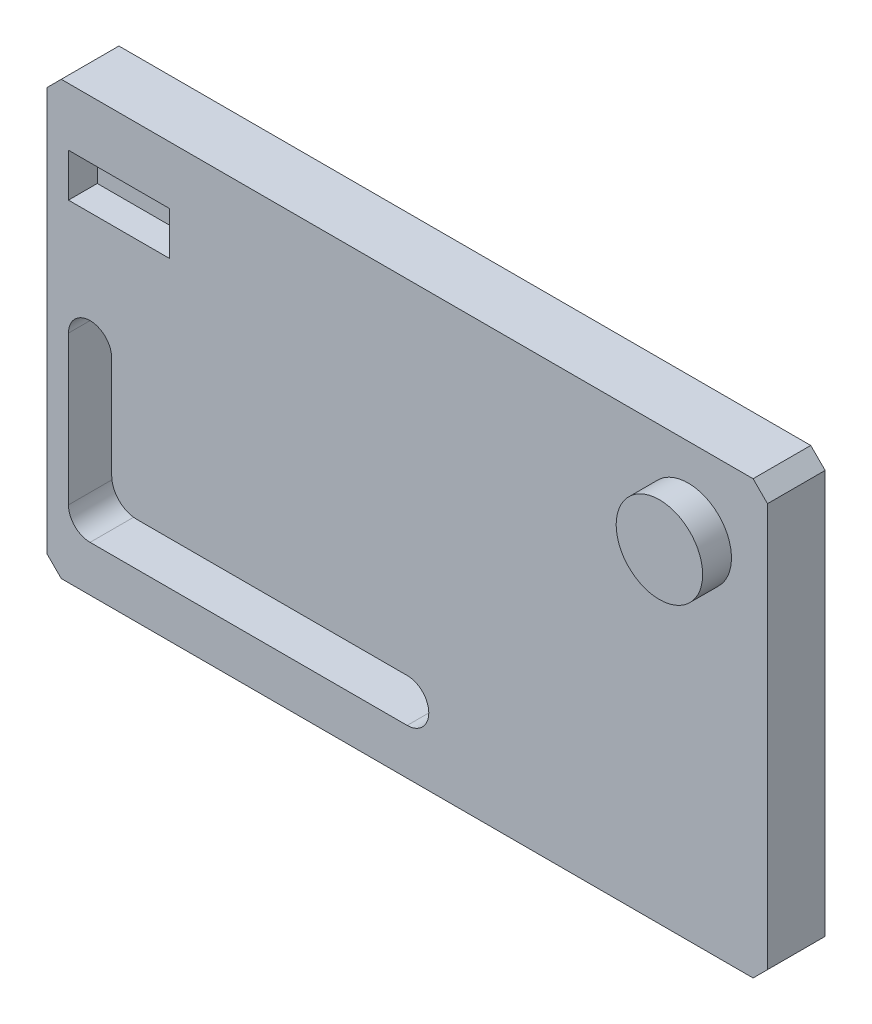
ISO-10303-21;
HEADER;
FILE_DESCRIPTION(('STEP AP214'),'2;1');
FILE_NAME('part.step','',(''),(''),'','','');
FILE_SCHEMA(('AUTOMOTIVE_DESIGN { 1 0 10303 214 1 1 1 1 }'));
ENDSEC;
DATA;
#1=APPLICATION_CONTEXT('core data for automotive mechanical design processes');
#2=APPLICATION_PROTOCOL_DEFINITION('international standard','automotive_design',2000,#1);
#3=PRODUCT_CONTEXT('',#1,'mechanical');
#4=PRODUCT('Part','Part','',(#3));
#5=PRODUCT_RELATED_PRODUCT_CATEGORY('part','',(#4));
#6=PRODUCT_DEFINITION_FORMATION('','',#4);
#7=PRODUCT_DEFINITION_CONTEXT('part definition',#1,'design');
#8=PRODUCT_DEFINITION('design','',#6,#7);
#9=PRODUCT_DEFINITION_SHAPE('','',#8);
#10=(LENGTH_UNIT() NAMED_UNIT(*) SI_UNIT(.MILLI.,.METRE.));
#11=(NAMED_UNIT(*) PLANE_ANGLE_UNIT() SI_UNIT($,.RADIAN.));
#12=(NAMED_UNIT(*) SI_UNIT($,.STERADIAN.) SOLID_ANGLE_UNIT());
#13=UNCERTAINTY_MEASURE_WITH_UNIT(LENGTH_MEASURE(1.E-05),#10,'distance_accuracy_value','');
#14=(GEOMETRIC_REPRESENTATION_CONTEXT(3) GLOBAL_UNCERTAINTY_ASSIGNED_CONTEXT((#13)) GLOBAL_UNIT_ASSIGNED_CONTEXT((#10,
#11,#12)) REPRESENTATION_CONTEXT('',''));
#15=CARTESIAN_POINT('',(0.,0.,0.));
#16=DIRECTION('',(0.,0.,1.));
#17=DIRECTION('',(1.,0.,0.));
#18=AXIS2_PLACEMENT_3D('',#15,#16,#17);
#19=CARTESIAN_POINT('',(0.,0.,2.));
#20=DIRECTION('',(0.,0.,-1.));
#21=DIRECTION('',(-1.,0.,0.));
#22=AXIS2_PLACEMENT_3D('',#19,#20,#21);
#23=PLANE('',#22);
#24=DIRECTION('',(0.,1.,0.));
#25=VECTOR('',#24,1.);
#26=CARTESIAN_POINT('',(-12.5,-7.5,2.));
#27=LINE('',#26,#25);
#28=CARTESIAN_POINT('',(-12.5,-7.,2.));
#29=VERTEX_POINT('',#28);
#30=CARTESIAN_POINT('',(-12.5,7.,2.));
#31=VERTEX_POINT('',#30);
#32=EDGE_CURVE('E291',#29,#31,#27,.T.);
#33=ORIENTED_EDGE('',*,*,#32,.F.);
#34=DIRECTION('',(0.707106781186548,-0.707106781186548,0.));
#35=VECTOR('',#34,1.);
#36=CARTESIAN_POINT('',(-12.,-7.5,2.));
#37=LINE('',#36,#35);
#38=CARTESIAN_POINT('',(-12.,-7.5,2.));
#39=VERTEX_POINT('',#38);
#40=EDGE_CURVE('E357',#29,#39,#37,.T.);
#41=ORIENTED_EDGE('',*,*,#40,.T.);
#42=DIRECTION('',(1.,0.,0.));
#43=VECTOR('',#42,1.);
#44=CARTESIAN_POINT('',(-12.5,-7.5,2.));
#45=LINE('',#44,#43);
#46=CARTESIAN_POINT('',(12.,-7.5,2.));
#47=VERTEX_POINT('',#46);
#48=EDGE_CURVE('E304',#39,#47,#45,.T.);
#49=ORIENTED_EDGE('',*,*,#48,.T.);
#50=DIRECTION('',(-0.70710678118655,-0.707106781186545,0.));
#51=VECTOR('',#50,1.);
#52=CARTESIAN_POINT('',(12.5,-7.,2.));
#53=LINE('',#52,#51);
#54=CARTESIAN_POINT('',(12.5,-7.,2.));
#55=VERTEX_POINT('',#54);
#56=EDGE_CURVE('E354',#47,#55,#53,.F.);
#57=ORIENTED_EDGE('',*,*,#56,.T.);
#58=DIRECTION('',(0.,1.,0.));
#59=VECTOR('',#58,1.);
#60=CARTESIAN_POINT('',(12.5,-7.5,2.));
#61=LINE('',#60,#59);
#62=CARTESIAN_POINT('',(12.5,7.,2.));
#63=VERTEX_POINT('',#62);
#64=EDGE_CURVE('E300',#55,#63,#61,.T.);
#65=ORIENTED_EDGE('',*,*,#64,.T.);
#66=DIRECTION('',(-0.707106781186548,0.707106781186548,0.));
#67=VECTOR('',#66,1.);
#68=CARTESIAN_POINT('',(12.,7.5,2.));
#69=LINE('',#68,#67);
#70=CARTESIAN_POINT('',(12.,7.5,2.));
#71=VERTEX_POINT('',#70);
#72=EDGE_CURVE('E348',#63,#71,#69,.T.);
#73=ORIENTED_EDGE('',*,*,#72,.T.);
#74=DIRECTION('',(1.,0.,0.));
#75=VECTOR('',#74,1.);
#76=CARTESIAN_POINT('',(-12.5,7.5,2.));
#77=LINE('',#76,#75);
#78=CARTESIAN_POINT('',(-12.,7.5,2.));
#79=VERTEX_POINT('',#78);
#80=EDGE_CURVE('E295',#79,#71,#77,.T.);
#81=ORIENTED_EDGE('',*,*,#80,.F.);
#82=DIRECTION('',(0.70710678118655,0.707106781186545,0.));
#83=VECTOR('',#82,1.);
#84=CARTESIAN_POINT('',(-12.5,7.,2.));
#85=LINE('',#84,#83);
#86=EDGE_CURVE('E351',#79,#31,#85,.F.);
#87=ORIENTED_EDGE('',*,*,#86,.T.);
#88=EDGE_LOOP('',(#33,#41,#49,#57,#65,#73,#81,#87));
#89=FACE_BOUND('',#88,.T.);
#90=CARTESIAN_POINT('',(9.75,4.7447,2.));
#91=DIRECTION('',(0.,0.,-1.));
#92=DIRECTION('',(-1.,0.,0.));
#93=AXIS2_PLACEMENT_3D('',#90,#91,#92);
#94=CIRCLE('',#93,1.5);
#95=CARTESIAN_POINT('',(8.25,4.7447,2.));
#96=VERTEX_POINT('',#95);
#97=EDGE_CURVE('E374',#96,#96,#94,.F.);
#98=ORIENTED_EDGE('',*,*,#97,.F.);
#99=EDGE_LOOP('',(#98));
#100=FACE_BOUND('',#99,.T.);
#101=DIRECTION('',(0.,-1.,0.));
#102=VECTOR('',#101,1.);
#103=CARTESIAN_POINT('',(-8.25,5.4947,2.));
#104=LINE('',#103,#102);
#105=CARTESIAN_POINT('',(-8.25,5.4947,2.));
#106=VERTEX_POINT('',#105);
#107=CARTESIAN_POINT('',(-8.25,3.9947,2.));
#108=VERTEX_POINT('',#107);
#109=EDGE_CURVE('E250',#106,#108,#104,.T.);
#110=ORIENTED_EDGE('',*,*,#109,.T.);
#111=DIRECTION('',(1.,0.,0.));
#112=VECTOR('',#111,1.);
#113=CARTESIAN_POINT('',(-11.75,3.9947,2.));
#114=LINE('',#113,#112);
#115=CARTESIAN_POINT('',(-11.75,3.9947,2.));
#116=VERTEX_POINT('',#115);
#117=EDGE_CURVE('E255',#116,#108,#114,.T.);
#118=ORIENTED_EDGE('',*,*,#117,.F.);
#119=DIRECTION('',(0.,-1.,0.));
#120=VECTOR('',#119,1.);
#121=CARTESIAN_POINT('',(-11.75,5.4947,2.));
#122=LINE('',#121,#120);
#123=CARTESIAN_POINT('',(-11.75,5.4947,2.));
#124=VERTEX_POINT('',#123);
#125=EDGE_CURVE('E260',#124,#116,#122,.T.);
#126=ORIENTED_EDGE('',*,*,#125,.F.);
#127=DIRECTION('',(1.,0.,0.));
#128=VECTOR('',#127,1.);
#129=CARTESIAN_POINT('',(-11.75,5.4947,2.));
#130=LINE('',#129,#128);
#131=EDGE_CURVE('E244',#124,#106,#130,.T.);
#132=ORIENTED_EDGE('',*,*,#131,.T.);
#133=EDGE_LOOP('',(#110,#118,#126,#132));
#134=FACE_BOUND('',#133,.T.);
#135=DIRECTION('',(0.,1.,0.));
#136=VECTOR('',#135,1.);
#137=CARTESIAN_POINT('',(-10.25,-5.16161867259879,2.));
#138=LINE('',#137,#136);
#139=CARTESIAN_POINT('',(-10.25,-3.53661867259879,2.));
#140=VERTEX_POINT('',#139);
#141=CARTESIAN_POINT('',(-10.25,0.,2.));
#142=VERTEX_POINT('',#141);
#143=EDGE_CURVE('E409',#140,#142,#138,.T.);
#144=ORIENTED_EDGE('',*,*,#143,.F.);
#145=CARTESIAN_POINT('',(-9.375,-3.53661867259879,2.));
#146=DIRECTION('',(0.,0.,-1.));
#147=DIRECTION('',(-1.,0.,0.));
#148=AXIS2_PLACEMENT_3D('',#145,#146,#147);
#149=CIRCLE('',#148,0.875);
#150=CARTESIAN_POINT('',(-9.375,-4.41161867259879,2.));
#151=VERTEX_POINT('',#150);
#152=EDGE_CURVE('E12',#140,#151,#149,.F.);
#153=ORIENTED_EDGE('',*,*,#152,.T.);
#154=DIRECTION('',(1.,0.,0.));
#155=VECTOR('',#154,1.);
#156=CARTESIAN_POINT('',(-11.,-4.41161867259879,2.));
#157=LINE('',#156,#155);
#158=CARTESIAN_POINT('',(0.,-4.41161867259879,2.));
#159=VERTEX_POINT('',#158);
#160=EDGE_CURVE('E226',#151,#159,#157,.T.);
#161=ORIENTED_EDGE('',*,*,#160,.T.);
#162=CARTESIAN_POINT('',(0.,-5.16161867259879,2.));
#163=DIRECTION('',(0.,0.,1.));
#164=DIRECTION('',(1.,0.,0.));
#165=AXIS2_PLACEMENT_3D('',#162,#163,#164);
#166=CIRCLE('',#165,0.75);
#167=CARTESIAN_POINT('',(0.,-5.91161867259879,2.));
#168=VERTEX_POINT('',#167);
#169=EDGE_CURVE('E217',#168,#159,#166,.T.);
#170=ORIENTED_EDGE('',*,*,#169,.F.);
#171=DIRECTION('',(1.,0.,0.));
#172=VECTOR('',#171,1.);
#173=CARTESIAN_POINT('',(-11.,-5.91161867259879,2.));
#174=LINE('',#173,#172);
#175=CARTESIAN_POINT('',(-11.,-5.91161867259879,2.));
#176=VERTEX_POINT('',#175);
#177=EDGE_CURVE('E212',#176,#168,#174,.T.);
#178=ORIENTED_EDGE('',*,*,#177,.F.);
#179=CARTESIAN_POINT('',(-11.,-5.16161867259879,2.));
#180=DIRECTION('',(0.,0.,1.));
#181=DIRECTION('',(1.,0.,0.));
#182=AXIS2_PLACEMENT_3D('',#179,#180,#181);
#183=CIRCLE('',#182,0.75);
#184=CARTESIAN_POINT('',(-11.75,-5.16161867259879,2.));
#185=VERTEX_POINT('',#184);
#186=EDGE_CURVE('E203',#185,#176,#183,.T.);
#187=ORIENTED_EDGE('',*,*,#186,.F.);
#188=DIRECTION('',(0.,1.,0.));
#189=VECTOR('',#188,1.);
#190=CARTESIAN_POINT('',(-11.75,-5.16161867259879,2.));
#191=LINE('',#190,#189);
#192=CARTESIAN_POINT('',(-11.75,0.,2.));
#193=VERTEX_POINT('',#192);
#194=EDGE_CURVE('E184',#185,#193,#191,.T.);
#195=ORIENTED_EDGE('',*,*,#194,.T.);
#196=CARTESIAN_POINT('',(-11.,0.,2.));
#197=DIRECTION('',(0.,0.,1.));
#198=DIRECTION('',(1.,0.,0.));
#199=AXIS2_PLACEMENT_3D('',#196,#197,#198);
#200=CIRCLE('',#199,0.750000000000001);
#201=EDGE_CURVE('E197',#142,#193,#200,.T.);
#202=ORIENTED_EDGE('',*,*,#201,.F.);
#203=EDGE_LOOP('',(#144,#153,#161,#170,#178,#187,#195,#202));
#204=FACE_BOUND('',#203,.T.);
#205=ADVANCED_FACE('F49',(#89,#100,#134,#204),#23,.F.);
#206=CARTESIAN_POINT('',(0.,0.,0.));
#207=DIRECTION('',(0.,0.,-1.));
#208=DIRECTION('',(-1.,0.,0.));
#209=AXIS2_PLACEMENT_3D('',#206,#207,#208);
#210=PLANE('',#209);
#211=DIRECTION('',(1.,0.,0.));
#212=VECTOR('',#211,1.);
#213=CARTESIAN_POINT('',(-12.5,-7.5,0.));
#214=LINE('',#213,#212);
#215=CARTESIAN_POINT('',(-12.,-7.5,0.));
#216=VERTEX_POINT('',#215);
#217=CARTESIAN_POINT('',(12.,-7.5,0.));
#218=VERTEX_POINT('',#217);
#219=EDGE_CURVE('E296',#216,#218,#214,.T.);
#220=ORIENTED_EDGE('',*,*,#219,.F.);
#221=DIRECTION('',(-0.707106781186548,0.707106781186548,0.));
#222=VECTOR('',#221,1.);
#223=CARTESIAN_POINT('',(-9.75,-9.75,0.));
#224=LINE('',#223,#222);
#225=CARTESIAN_POINT('',(-12.5,-7.,0.));
#226=VERTEX_POINT('',#225);
#227=EDGE_CURVE('E338',#216,#226,#224,.T.);
#228=ORIENTED_EDGE('',*,*,#227,.T.);
#229=DIRECTION('',(0.,1.,0.));
#230=VECTOR('',#229,1.);
#231=CARTESIAN_POINT('',(-12.5,-7.5,0.));
#232=LINE('',#231,#230);
#233=CARTESIAN_POINT('',(-12.5,7.,0.));
#234=VERTEX_POINT('',#233);
#235=EDGE_CURVE('E290',#226,#234,#232,.T.);
#236=ORIENTED_EDGE('',*,*,#235,.T.);
#237=DIRECTION('',(-0.70710678118655,-0.707106781186545,0.));
#238=VECTOR('',#237,1.);
#239=CARTESIAN_POINT('',(-9.74999999999996,9.75000000000002,0.));
#240=LINE('',#239,#238);
#241=CARTESIAN_POINT('',(-12.,7.5,0.));
#242=VERTEX_POINT('',#241);
#243=EDGE_CURVE('E332',#234,#242,#240,.F.);
#244=ORIENTED_EDGE('',*,*,#243,.T.);
#245=DIRECTION('',(1.,0.,0.));
#246=VECTOR('',#245,1.);
#247=CARTESIAN_POINT('',(-12.5,7.5,0.));
#248=LINE('',#247,#246);
#249=CARTESIAN_POINT('',(12.,7.5,0.));
#250=VERTEX_POINT('',#249);
#251=EDGE_CURVE('E312',#242,#250,#248,.T.);
#252=ORIENTED_EDGE('',*,*,#251,.T.);
#253=DIRECTION('',(0.707106781186548,-0.707106781186548,0.));
#254=VECTOR('',#253,1.);
#255=CARTESIAN_POINT('',(9.75,9.75,0.));
#256=LINE('',#255,#254);
#257=CARTESIAN_POINT('',(12.5,7.,0.));
#258=VERTEX_POINT('',#257);
#259=EDGE_CURVE('E329',#250,#258,#256,.T.);
#260=ORIENTED_EDGE('',*,*,#259,.T.);
#261=DIRECTION('',(0.,1.,0.));
#262=VECTOR('',#261,1.);
#263=CARTESIAN_POINT('',(12.5,-7.5,0.));
#264=LINE('',#263,#262);
#265=CARTESIAN_POINT('',(12.5,-7.,0.));
#266=VERTEX_POINT('',#265);
#267=EDGE_CURVE('E316',#266,#258,#264,.T.);
#268=ORIENTED_EDGE('',*,*,#267,.F.);
#269=DIRECTION('',(0.70710678118655,0.707106781186545,0.));
#270=VECTOR('',#269,1.);
#271=CARTESIAN_POINT('',(9.74999999999996,-9.75000000000003,0.));
#272=LINE('',#271,#270);
#273=EDGE_CURVE('E335',#266,#218,#272,.F.);
#274=ORIENTED_EDGE('',*,*,#273,.T.);
#275=EDGE_LOOP('',(#220,#228,#236,#244,#252,#260,#268,#274));
#276=FACE_BOUND('',#275,.T.);
#277=DIRECTION('',(1.,0.,0.));
#278=VECTOR('',#277,1.);
#279=CARTESIAN_POINT('',(-11.,-4.41161867259879,0.));
#280=LINE('',#279,#278);
#281=CARTESIAN_POINT('',(-9.375,-4.41161867259879,0.));
#282=VERTEX_POINT('',#281);
#283=CARTESIAN_POINT('',(0.,-4.41161867259879,0.));
#284=VERTEX_POINT('',#283);
#285=EDGE_CURVE('E219',#282,#284,#280,.T.);
#286=ORIENTED_EDGE('',*,*,#285,.F.);
#287=CARTESIAN_POINT('',(-9.375,-3.53661867259879,0.));
#288=DIRECTION('',(0.,0.,-1.));
#289=DIRECTION('',(-1.,0.,0.));
#290=AXIS2_PLACEMENT_3D('',#287,#288,#289);
#291=CIRCLE('',#290,0.875);
#292=CARTESIAN_POINT('',(-10.25,-3.53661867259879,0.));
#293=VERTEX_POINT('',#292);
#294=EDGE_CURVE('E72',#282,#293,#291,.T.);
#295=ORIENTED_EDGE('',*,*,#294,.T.);
#296=DIRECTION('',(0.,1.,0.));
#297=VECTOR('',#296,1.);
#298=CARTESIAN_POINT('',(-10.25,-5.16161867259879,0.));
#299=LINE('',#298,#297);
#300=CARTESIAN_POINT('',(-10.25,0.,0.));
#301=VERTEX_POINT('',#300);
#302=EDGE_CURVE('E397',#293,#301,#299,.T.);
#303=ORIENTED_EDGE('',*,*,#302,.T.);
#304=CARTESIAN_POINT('',(-11.,0.,0.));
#305=DIRECTION('',(0.,0.,-1.));
#306=DIRECTION('',(-1.,0.,0.));
#307=AXIS2_PLACEMENT_3D('',#304,#305,#306);
#308=CIRCLE('',#307,0.750000000000001);
#309=CARTESIAN_POINT('',(-11.75,0.,0.));
#310=VERTEX_POINT('',#309);
#311=EDGE_CURVE('E207',#301,#310,#308,.F.);
#312=ORIENTED_EDGE('',*,*,#311,.T.);
#313=DIRECTION('',(0.,1.,0.));
#314=VECTOR('',#313,1.);
#315=CARTESIAN_POINT('',(-11.75,-5.16161867259879,0.));
#316=LINE('',#315,#314);
#317=CARTESIAN_POINT('',(-11.75,-5.16161867259879,0.));
#318=VERTEX_POINT('',#317);
#319=EDGE_CURVE('E412',#318,#310,#316,.T.);
#320=ORIENTED_EDGE('',*,*,#319,.F.);
#321=CARTESIAN_POINT('',(-11.,-5.16161867259879,0.));
#322=DIRECTION('',(0.,0.,-1.));
#323=DIRECTION('',(-1.,0.,0.));
#324=AXIS2_PLACEMENT_3D('',#321,#322,#323);
#325=CIRCLE('',#324,0.75);
#326=CARTESIAN_POINT('',(-11.,-5.91161867259879,0.));
#327=VERTEX_POINT('',#326);
#328=EDGE_CURVE('E205',#318,#327,#325,.F.);
#329=ORIENTED_EDGE('',*,*,#328,.T.);
#330=DIRECTION('',(1.,0.,0.));
#331=VECTOR('',#330,1.);
#332=CARTESIAN_POINT('',(-11.,-5.91161867259879,0.));
#333=LINE('',#332,#331);
#334=CARTESIAN_POINT('',(0.,-5.91161867259879,0.));
#335=VERTEX_POINT('',#334);
#336=EDGE_CURVE('E234',#327,#335,#333,.T.);
#337=ORIENTED_EDGE('',*,*,#336,.T.);
#338=CARTESIAN_POINT('',(0.,-5.16161867259879,0.));
#339=DIRECTION('',(0.,0.,-1.));
#340=DIRECTION('',(-1.,0.,0.));
#341=AXIS2_PLACEMENT_3D('',#338,#339,#340);
#342=CIRCLE('',#341,0.75);
#343=EDGE_CURVE('E394',#335,#284,#342,.F.);
#344=ORIENTED_EDGE('',*,*,#343,.T.);
#345=EDGE_LOOP('',(#286,#295,#303,#312,#320,#329,#337,#344));
#346=FACE_BOUND('',#345,.T.);
#347=ADVANCED_FACE('F392',(#276,#346),#210,.T.);
#348=CARTESIAN_POINT('',(-11.,-5.16161867259879,-0.00100000000000013));
#349=DIRECTION('',(0.,0.,1.));
#350=DIRECTION('',(1.,0.,0.));
#351=AXIS2_PLACEMENT_3D('',#348,#349,#350);
#352=CYLINDRICAL_SURFACE('',#351,0.75);
#353=DIRECTION('',(0.,0.,1.));
#354=VECTOR('',#353,1.);
#355=CARTESIAN_POINT('',(-11.75,-5.16161867259879,-0.00100000000000013));
#356=LINE('',#355,#354);
#357=EDGE_CURVE('E187',#318,#185,#356,.T.);
#358=ORIENTED_EDGE('',*,*,#357,.T.);
#359=ORIENTED_EDGE('',*,*,#186,.T.);
#360=DIRECTION('',(0.,0.,1.));
#361=VECTOR('',#360,1.);
#362=CARTESIAN_POINT('',(-11.,-5.91161867259879,-0.00100000000000013));
#363=LINE('',#362,#361);
#364=EDGE_CURVE('E229',#327,#176,#363,.T.);
#365=ORIENTED_EDGE('',*,*,#364,.F.);
#366=ORIENTED_EDGE('',*,*,#328,.F.);
#367=EDGE_LOOP('',(#358,#359,#365,#366));
#368=FACE_BOUND('',#367,.T.);
#369=ADVANCED_FACE('F201',(#368),#352,.F.);
#370=CARTESIAN_POINT('',(-12.5,-7.5,2.));
#371=DIRECTION('',(-1.,0.,0.));
#372=DIRECTION('',(0.,0.,1.));
#373=AXIS2_PLACEMENT_3D('',#370,#371,#372);
#374=PLANE('',#373);
#375=ORIENTED_EDGE('',*,*,#235,.F.);
#376=DIRECTION('',(0.,0.,1.));
#377=VECTOR('',#376,1.);
#378=CARTESIAN_POINT('',(-12.5,-7.,2.));
#379=LINE('',#378,#377);
#380=EDGE_CURVE('E345',#226,#29,#379,.T.);
#381=ORIENTED_EDGE('',*,*,#380,.T.);
#382=ORIENTED_EDGE('',*,*,#32,.T.);
#383=DIRECTION('',(0.,0.,-1.));
#384=VECTOR('',#383,1.);
#385=CARTESIAN_POINT('',(-12.5,7.,2.));
#386=LINE('',#385,#384);
#387=EDGE_CURVE('E341',#31,#234,#386,.T.);
#388=ORIENTED_EDGE('',*,*,#387,.T.);
#389=EDGE_LOOP('',(#375,#381,#382,#388));
#390=FACE_BOUND('',#389,.T.);
#391=ADVANCED_FACE('F446',(#390),#374,.T.);
#392=CARTESIAN_POINT('',(-12.5,-7.5,2.));
#393=DIRECTION('',(0.,1.,0.));
#394=DIRECTION('',(0.,0.,1.));
#395=AXIS2_PLACEMENT_3D('',#392,#393,#394);
#396=PLANE('',#395);
#397=ORIENTED_EDGE('',*,*,#48,.F.);
#398=DIRECTION('',(0.,0.,-1.));
#399=VECTOR('',#398,1.);
#400=CARTESIAN_POINT('',(-12.,-7.5,0.));
#401=LINE('',#400,#399);
#402=EDGE_CURVE('E325',#39,#216,#401,.T.);
#403=ORIENTED_EDGE('',*,*,#402,.T.);
#404=ORIENTED_EDGE('',*,*,#219,.T.);
#405=DIRECTION('',(0.,0.,1.));
#406=VECTOR('',#405,1.);
#407=CARTESIAN_POINT('',(12.,-7.5,2.));
#408=LINE('',#407,#406);
#409=EDGE_CURVE('E308',#218,#47,#408,.T.);
#410=ORIENTED_EDGE('',*,*,#409,.T.);
#411=EDGE_LOOP('',(#397,#403,#404,#410));
#412=FACE_BOUND('',#411,.T.);
#413=ADVANCED_FACE('F442',(#412),#396,.F.);
#414=CARTESIAN_POINT('',(12.5,-7.5,2.));
#415=DIRECTION('',(-1.,0.,0.));
#416=DIRECTION('',(0.,0.,1.));
#417=AXIS2_PLACEMENT_3D('',#414,#415,#416);
#418=PLANE('',#417);
#419=ORIENTED_EDGE('',*,*,#64,.F.);
#420=DIRECTION('',(0.,0.,-1.));
#421=VECTOR('',#420,1.);
#422=CARTESIAN_POINT('',(12.5,-7.,2.));
#423=LINE('',#422,#421);
#424=EDGE_CURVE('E363',#55,#266,#423,.T.);
#425=ORIENTED_EDGE('',*,*,#424,.T.);
#426=ORIENTED_EDGE('',*,*,#267,.T.);
#427=DIRECTION('',(0.,0.,1.));
#428=VECTOR('',#427,1.);
#429=CARTESIAN_POINT('',(12.5,7.,2.));
#430=LINE('',#429,#428);
#431=EDGE_CURVE('E360',#258,#63,#430,.T.);
#432=ORIENTED_EDGE('',*,*,#431,.T.);
#433=EDGE_LOOP('',(#419,#425,#426,#432));
#434=FACE_BOUND('',#433,.T.);
#435=ADVANCED_FACE('F445',(#434),#418,.F.);
#436=CARTESIAN_POINT('',(-12.5,7.5,2.));
#437=DIRECTION('',(0.,1.,0.));
#438=DIRECTION('',(0.,0.,1.));
#439=AXIS2_PLACEMENT_3D('',#436,#437,#438);
#440=PLANE('',#439);
#441=ORIENTED_EDGE('',*,*,#251,.F.);
#442=DIRECTION('',(0.,0.,1.));
#443=VECTOR('',#442,1.);
#444=CARTESIAN_POINT('',(-12.,7.5,2.));
#445=LINE('',#444,#443);
#446=EDGE_CURVE('E371',#242,#79,#445,.T.);
#447=ORIENTED_EDGE('',*,*,#446,.T.);
#448=ORIENTED_EDGE('',*,*,#80,.T.);
#449=DIRECTION('',(0.,0.,-1.));
#450=VECTOR('',#449,1.);
#451=CARTESIAN_POINT('',(12.,7.5,0.));
#452=LINE('',#451,#450);
#453=EDGE_CURVE('E367',#71,#250,#452,.T.);
#454=ORIENTED_EDGE('',*,*,#453,.T.);
#455=EDGE_LOOP('',(#441,#447,#448,#454));
#456=FACE_BOUND('',#455,.T.);
#457=ADVANCED_FACE('F450',(#456),#440,.T.);
#458=CARTESIAN_POINT('',(-12.,-7.5,2.));
#459=DIRECTION('',(-0.707106781186547,-0.707106781186547,0.));
#460=DIRECTION('',(0.,0.,1.));
#461=AXIS2_PLACEMENT_3D('',#458,#459,#460);
#462=PLANE('',#461);
#463=ORIENTED_EDGE('',*,*,#40,.F.);
#464=ORIENTED_EDGE('',*,*,#380,.F.);
#465=ORIENTED_EDGE('',*,*,#227,.F.);
#466=ORIENTED_EDGE('',*,*,#402,.F.);
#467=EDGE_LOOP('',(#463,#464,#465,#466));
#468=FACE_BOUND('',#467,.T.);
#469=ADVANCED_FACE('F454',(#468),#462,.T.);
#470=CARTESIAN_POINT('',(12.5,-7.,2.));
#471=DIRECTION('',(-0.707106781186545,0.70710678118655,0.));
#472=DIRECTION('',(0.,0.,-1.));
#473=AXIS2_PLACEMENT_3D('',#470,#471,#472);
#474=PLANE('',#473);
#475=ORIENTED_EDGE('',*,*,#56,.F.);
#476=ORIENTED_EDGE('',*,*,#409,.F.);
#477=ORIENTED_EDGE('',*,*,#273,.F.);
#478=ORIENTED_EDGE('',*,*,#424,.F.);
#479=EDGE_LOOP('',(#475,#476,#477,#478));
#480=FACE_BOUND('',#479,.T.);
#481=ADVANCED_FACE('F465',(#480),#474,.F.);
#482=CARTESIAN_POINT('',(-12.5,7.,2.));
#483=DIRECTION('',(0.707106781186545,-0.70710678118655,0.));
#484=DIRECTION('',(0.,0.,-1.));
#485=AXIS2_PLACEMENT_3D('',#482,#483,#484);
#486=PLANE('',#485);
#487=ORIENTED_EDGE('',*,*,#86,.F.);
#488=ORIENTED_EDGE('',*,*,#446,.F.);
#489=ORIENTED_EDGE('',*,*,#243,.F.);
#490=ORIENTED_EDGE('',*,*,#387,.F.);
#491=EDGE_LOOP('',(#487,#488,#489,#490));
#492=FACE_BOUND('',#491,.T.);
#493=ADVANCED_FACE('F472',(#492),#486,.F.);
#494=CARTESIAN_POINT('',(12.,7.5,2.));
#495=DIRECTION('',(0.707106781186547,0.707106781186547,0.));
#496=DIRECTION('',(0.,0.,1.));
#497=AXIS2_PLACEMENT_3D('',#494,#495,#496);
#498=PLANE('',#497);
#499=ORIENTED_EDGE('',*,*,#72,.F.);
#500=ORIENTED_EDGE('',*,*,#431,.F.);
#501=ORIENTED_EDGE('',*,*,#259,.F.);
#502=ORIENTED_EDGE('',*,*,#453,.F.);
#503=EDGE_LOOP('',(#499,#500,#501,#502));
#504=FACE_BOUND('',#503,.T.);
#505=ADVANCED_FACE('F478',(#504),#498,.T.);
#506=CARTESIAN_POINT('',(9.75,4.7447,3.));
#507=DIRECTION('',(0.,0.,-1.));
#508=DIRECTION('',(-1.,0.,0.));
#509=AXIS2_PLACEMENT_3D('',#506,#507,#508);
#510=CYLINDRICAL_SURFACE('',#509,1.5);
#511=CARTESIAN_POINT('',(9.75,4.7447,3.));
#512=DIRECTION('',(0.,0.,1.));
#513=DIRECTION('',(1.,0.,0.));
#514=AXIS2_PLACEMENT_3D('',#511,#512,#513);
#515=CIRCLE('',#514,1.5);
#516=CARTESIAN_POINT('',(11.25,4.7447,3.));
#517=VERTEX_POINT('',#516);
#518=EDGE_CURVE('E286',#517,#517,#515,.T.);
#519=ORIENTED_EDGE('',*,*,#518,.F.);
#520=EDGE_LOOP('',(#519));
#521=FACE_BOUND('',#520,.T.);
#522=ORIENTED_EDGE('',*,*,#97,.T.);
#523=EDGE_LOOP('',(#522));
#524=FACE_BOUND('',#523,.T.);
#525=ADVANCED_FACE('F439',(#521,#524),#510,.T.);
#526=CARTESIAN_POINT('',(9.75,4.7447,3.));
#527=DIRECTION('',(0.,0.,1.));
#528=DIRECTION('',(1.,0.,0.));
#529=AXIS2_PLACEMENT_3D('',#526,#527,#528);
#530=PLANE('',#529);
#531=ORIENTED_EDGE('',*,*,#518,.T.);
#532=EDGE_LOOP('',(#531));
#533=FACE_BOUND('',#532,.T.);
#534=ADVANCED_FACE('F487',(#533),#530,.T.);
#535=CARTESIAN_POINT('',(0.,0.,1.));
#536=DIRECTION('',(0.,0.,-1.));
#537=DIRECTION('',(-1.,0.,0.));
#538=AXIS2_PLACEMENT_3D('',#535,#536,#537);
#539=PLANE('',#538);
#540=DIRECTION('',(0.,-1.,0.));
#541=VECTOR('',#540,1.);
#542=CARTESIAN_POINT('',(-11.75,5.4947,1.));
#543=LINE('',#542,#541);
#544=CARTESIAN_POINT('',(-11.75,5.4947,1.));
#545=VERTEX_POINT('',#544);
#546=CARTESIAN_POINT('',(-11.75,3.9947,1.));
#547=VERTEX_POINT('',#546);
#548=EDGE_CURVE('E248',#545,#547,#543,.T.);
#549=ORIENTED_EDGE('',*,*,#548,.T.);
#550=DIRECTION('',(1.,0.,0.));
#551=VECTOR('',#550,1.);
#552=CARTESIAN_POINT('',(-11.75,3.9947,1.));
#553=LINE('',#552,#551);
#554=CARTESIAN_POINT('',(-8.25,3.9947,1.));
#555=VERTEX_POINT('',#554);
#556=EDGE_CURVE('E259',#547,#555,#553,.T.);
#557=ORIENTED_EDGE('',*,*,#556,.T.);
#558=DIRECTION('',(0.,-1.,0.));
#559=VECTOR('',#558,1.);
#560=CARTESIAN_POINT('',(-8.25,5.4947,1.));
#561=LINE('',#560,#559);
#562=CARTESIAN_POINT('',(-8.25,5.4947,1.));
#563=VERTEX_POINT('',#562);
#564=EDGE_CURVE('E264',#563,#555,#561,.T.);
#565=ORIENTED_EDGE('',*,*,#564,.F.);
#566=DIRECTION('',(1.,0.,0.));
#567=VECTOR('',#566,1.);
#568=CARTESIAN_POINT('',(-11.75,5.4947,1.));
#569=LINE('',#568,#567);
#570=EDGE_CURVE('E243',#545,#563,#569,.T.);
#571=ORIENTED_EDGE('',*,*,#570,.F.);
#572=EDGE_LOOP('',(#549,#557,#565,#571));
#573=FACE_BOUND('',#572,.T.);
#574=ADVANCED_FACE('F511',(#573),#539,.F.);
#575=CARTESIAN_POINT('',(-11.75,3.9947,-3.80788655293195));
#576=DIRECTION('',(0.,-1.,0.));
#577=DIRECTION('',(0.,0.,-1.));
#578=AXIS2_PLACEMENT_3D('',#575,#576,#577);
#579=PLANE('',#578);
#580=DIRECTION('',(0.,0.,1.));
#581=VECTOR('',#580,1.);
#582=CARTESIAN_POINT('',(-11.75,3.9947,-3.80788655293195));
#583=LINE('',#582,#581);
#584=EDGE_CURVE('E272',#547,#116,#583,.T.);
#585=ORIENTED_EDGE('',*,*,#584,.T.);
#586=ORIENTED_EDGE('',*,*,#117,.T.);
#587=DIRECTION('',(0.,0.,1.));
#588=VECTOR('',#587,1.);
#589=CARTESIAN_POINT('',(-8.25,3.9947,-3.80788655293195));
#590=LINE('',#589,#588);
#591=EDGE_CURVE('E268',#555,#108,#590,.T.);
#592=ORIENTED_EDGE('',*,*,#591,.F.);
#593=ORIENTED_EDGE('',*,*,#556,.F.);
#594=EDGE_LOOP('',(#585,#586,#592,#593));
#595=FACE_BOUND('',#594,.T.);
#596=ADVANCED_FACE('F526',(#595),#579,.F.);
#597=CARTESIAN_POINT('',(-8.25,5.4947,-3.80788655293195));
#598=DIRECTION('',(-1.,0.,0.));
#599=DIRECTION('',(0.,0.,1.));
#600=AXIS2_PLACEMENT_3D('',#597,#598,#599);
#601=PLANE('',#600);
#602=ORIENTED_EDGE('',*,*,#564,.T.);
#603=ORIENTED_EDGE('',*,*,#591,.T.);
#604=ORIENTED_EDGE('',*,*,#109,.F.);
#605=DIRECTION('',(0.,0.,1.));
#606=VECTOR('',#605,1.);
#607=CARTESIAN_POINT('',(-8.25,5.4947,-3.80788655293195));
#608=LINE('',#607,#606);
#609=EDGE_CURVE('E254',#563,#106,#608,.T.);
#610=ORIENTED_EDGE('',*,*,#609,.F.);
#611=EDGE_LOOP('',(#602,#603,#604,#610));
#612=FACE_BOUND('',#611,.T.);
#613=ADVANCED_FACE('F522',(#612),#601,.T.);
#614=CARTESIAN_POINT('',(-11.75,5.4947,-3.80788655293195));
#615=DIRECTION('',(0.,-1.,0.));
#616=DIRECTION('',(0.,0.,-1.));
#617=AXIS2_PLACEMENT_3D('',#614,#615,#616);
#618=PLANE('',#617);
#619=ORIENTED_EDGE('',*,*,#570,.T.);
#620=ORIENTED_EDGE('',*,*,#609,.T.);
#621=ORIENTED_EDGE('',*,*,#131,.F.);
#622=DIRECTION('',(0.,0.,1.));
#623=VECTOR('',#622,1.);
#624=CARTESIAN_POINT('',(-11.75,5.4947,-3.80788655293195));
#625=LINE('',#624,#623);
#626=EDGE_CURVE('E249',#545,#124,#625,.T.);
#627=ORIENTED_EDGE('',*,*,#626,.F.);
#628=EDGE_LOOP('',(#619,#620,#621,#627));
#629=FACE_BOUND('',#628,.T.);
#630=ADVANCED_FACE('F533',(#629),#618,.T.);
#631=CARTESIAN_POINT('',(-11.75,5.4947,-3.80788655293195));
#632=DIRECTION('',(-1.,0.,0.));
#633=DIRECTION('',(0.,0.,1.));
#634=AXIS2_PLACEMENT_3D('',#631,#632,#633);
#635=PLANE('',#634);
#636=ORIENTED_EDGE('',*,*,#626,.T.);
#637=ORIENTED_EDGE('',*,*,#125,.T.);
#638=ORIENTED_EDGE('',*,*,#584,.F.);
#639=ORIENTED_EDGE('',*,*,#548,.F.);
#640=EDGE_LOOP('',(#636,#637,#638,#639));
#641=FACE_BOUND('',#640,.T.);
#642=ADVANCED_FACE('F529',(#641),#635,.F.);
#643=CARTESIAN_POINT('',(-11.,-4.41161867259879,-0.00100000000000013));
#644=DIRECTION('',(0.,-1.,0.));
#645=DIRECTION('',(0.,0.,-1.));
#646=AXIS2_PLACEMENT_3D('',#643,#644,#645);
#647=PLANE('',#646);
#648=ORIENTED_EDGE('',*,*,#160,.F.);
#649=DIRECTION('',(0.,0.,-1.));
#650=VECTOR('',#649,1.);
#651=CARTESIAN_POINT('',(-9.375,-4.41161867259879,0.));
#652=LINE('',#651,#650);
#653=EDGE_CURVE('E378',#151,#282,#652,.T.);
#654=ORIENTED_EDGE('',*,*,#653,.T.);
#655=ORIENTED_EDGE('',*,*,#285,.T.);
#656=DIRECTION('',(0.,0.,1.));
#657=VECTOR('',#656,1.);
#658=CARTESIAN_POINT('',(0.,-4.41161867259879,-0.00100000000000013));
#659=LINE('',#658,#657);
#660=EDGE_CURVE('E230',#284,#159,#659,.T.);
#661=ORIENTED_EDGE('',*,*,#660,.T.);
#662=EDGE_LOOP('',(#648,#654,#655,#661));
#663=FACE_BOUND('',#662,.T.);
#664=ADVANCED_FACE('F387',(#663),#647,.T.);
#665=CARTESIAN_POINT('',(0.,-5.16161867259879,-0.00100000000000013));
#666=DIRECTION('',(0.,0.,1.));
#667=DIRECTION('',(1.,0.,0.));
#668=AXIS2_PLACEMENT_3D('',#665,#666,#667);
#669=CYLINDRICAL_SURFACE('',#668,0.75);
#670=DIRECTION('',(0.,0.,1.));
#671=VECTOR('',#670,1.);
#672=CARTESIAN_POINT('',(0.,-5.91161867259879,-0.00100000000000013));
#673=LINE('',#672,#671);
#674=EDGE_CURVE('E235',#335,#168,#673,.T.);
#675=ORIENTED_EDGE('',*,*,#674,.T.);
#676=ORIENTED_EDGE('',*,*,#169,.T.);
#677=ORIENTED_EDGE('',*,*,#660,.F.);
#678=ORIENTED_EDGE('',*,*,#343,.F.);
#679=EDGE_LOOP('',(#675,#676,#677,#678));
#680=FACE_BOUND('',#679,.T.);
#681=ADVANCED_FACE('F553',(#680),#669,.F.);
#682=CARTESIAN_POINT('',(-11.,-5.91161867259879,-0.00100000000000013));
#683=DIRECTION('',(0.,-1.,0.));
#684=DIRECTION('',(0.,0.,-1.));
#685=AXIS2_PLACEMENT_3D('',#682,#683,#684);
#686=PLANE('',#685);
#687=ORIENTED_EDGE('',*,*,#364,.T.);
#688=ORIENTED_EDGE('',*,*,#177,.T.);
#689=ORIENTED_EDGE('',*,*,#674,.F.);
#690=ORIENTED_EDGE('',*,*,#336,.F.);
#691=EDGE_LOOP('',(#687,#688,#689,#690));
#692=FACE_BOUND('',#691,.T.);
#693=ADVANCED_FACE('F550',(#692),#686,.F.);
#694=CARTESIAN_POINT('',(-11.75,-5.16161867259879,-0.00100000000000013));
#695=DIRECTION('',(1.,0.,0.));
#696=DIRECTION('',(0.,1.,0.));
#697=AXIS2_PLACEMENT_3D('',#694,#695,#696);
#698=PLANE('',#697);
#699=ORIENTED_EDGE('',*,*,#319,.T.);
#700=DIRECTION('',(0.,0.,1.));
#701=VECTOR('',#700,1.);
#702=CARTESIAN_POINT('',(-11.75,0.,-0.00100000000000013));
#703=LINE('',#702,#701);
#704=EDGE_CURVE('E190',#310,#193,#703,.T.);
#705=ORIENTED_EDGE('',*,*,#704,.T.);
#706=ORIENTED_EDGE('',*,*,#194,.F.);
#707=ORIENTED_EDGE('',*,*,#357,.F.);
#708=EDGE_LOOP('',(#699,#705,#706,#707));
#709=FACE_BOUND('',#708,.T.);
#710=ADVANCED_FACE('F186',(#709),#698,.T.);
#711=CARTESIAN_POINT('',(-11.,0.,-0.00100000000000013));
#712=DIRECTION('',(0.,0.,1.));
#713=DIRECTION('',(1.,0.,0.));
#714=AXIS2_PLACEMENT_3D('',#711,#712,#713);
#715=CYLINDRICAL_SURFACE('',#714,0.750000000000001);
#716=DIRECTION('',(0.,0.,1.));
#717=VECTOR('',#716,1.);
#718=CARTESIAN_POINT('',(-10.25,0.,-0.00100000000000013));
#719=LINE('',#718,#717);
#720=EDGE_CURVE('E196',#301,#142,#719,.T.);
#721=ORIENTED_EDGE('',*,*,#720,.T.);
#722=ORIENTED_EDGE('',*,*,#201,.T.);
#723=ORIENTED_EDGE('',*,*,#704,.F.);
#724=ORIENTED_EDGE('',*,*,#311,.F.);
#725=EDGE_LOOP('',(#721,#722,#723,#724));
#726=FACE_BOUND('',#725,.T.);
#727=ADVANCED_FACE('F420',(#726),#715,.F.);
#728=CARTESIAN_POINT('',(-10.25,-5.16161867259879,-0.00100000000000013));
#729=DIRECTION('',(1.,0.,0.));
#730=DIRECTION('',(0.,1.,0.));
#731=AXIS2_PLACEMENT_3D('',#728,#729,#730);
#732=PLANE('',#731);
#733=ORIENTED_EDGE('',*,*,#302,.F.);
#734=DIRECTION('',(0.,0.,-1.));
#735=VECTOR('',#734,1.);
#736=CARTESIAN_POINT('',(-10.25,-3.53661867259879,2.));
#737=LINE('',#736,#735);
#738=EDGE_CURVE('E58',#293,#140,#737,.F.);
#739=ORIENTED_EDGE('',*,*,#738,.T.);
#740=ORIENTED_EDGE('',*,*,#143,.T.);
#741=ORIENTED_EDGE('',*,*,#720,.F.);
#742=EDGE_LOOP('',(#733,#739,#740,#741));
#743=FACE_BOUND('',#742,.T.);
#744=ADVANCED_FACE('F421',(#743),#732,.F.);
#745=CARTESIAN_POINT('',(-9.375,-3.53661867259879,-0.00100000000000013));
#746=DIRECTION('',(0.,0.,1.));
#747=DIRECTION('',(1.,0.,0.));
#748=AXIS2_PLACEMENT_3D('',#745,#746,#747);
#749=CYLINDRICAL_SURFACE('',#748,0.875);
#750=ORIENTED_EDGE('',*,*,#152,.F.);
#751=ORIENTED_EDGE('',*,*,#738,.F.);
#752=ORIENTED_EDGE('',*,*,#294,.F.);
#753=ORIENTED_EDGE('',*,*,#653,.F.);
#754=EDGE_LOOP('',(#750,#751,#752,#753));
#755=FACE_BOUND('',#754,.T.);
#756=ADVANCED_FACE('F51',(#755),#749,.T.);
#757=CLOSED_SHELL('',(#205,#347,#369,#391,#413,#435,#457,#469,#481,#493,#505,#525,#534,#574,
#596,#613,#630,#642,#664,#681,#693,#710,#727,#744,#756));
#758=MANIFOLD_SOLID_BREP('B2',#757);
#759=ADVANCED_BREP_SHAPE_REPRESENTATION('',(#18,#758),#14);
#760=SHAPE_DEFINITION_REPRESENTATION(#9,#759);
ENDSEC;
END-ISO-10303-21;
